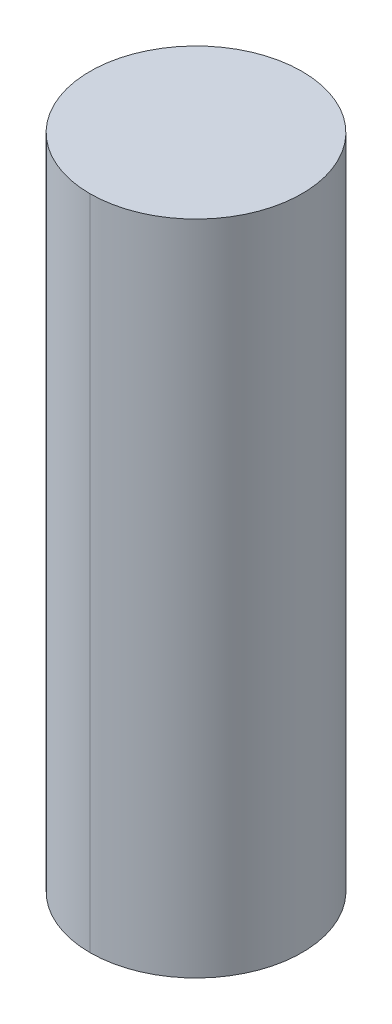
ISO-10303-21;
HEADER;
FILE_DESCRIPTION(('STEP AP214'),'2;1');
FILE_NAME('part.step','',(''),(''),'','','');
FILE_SCHEMA(('AUTOMOTIVE_DESIGN { 1 0 10303 214 1 1 1 1 }'));
ENDSEC;
DATA;
#1=APPLICATION_CONTEXT('core data for automotive mechanical design processes');
#2=APPLICATION_PROTOCOL_DEFINITION('international standard','automotive_design',2000,#1);
#3=PRODUCT_CONTEXT('',#1,'mechanical');
#4=PRODUCT('Part','Part','',(#3));
#5=PRODUCT_RELATED_PRODUCT_CATEGORY('part','',(#4));
#6=PRODUCT_DEFINITION_FORMATION('','',#4);
#7=PRODUCT_DEFINITION_CONTEXT('part definition',#1,'design');
#8=PRODUCT_DEFINITION('design','',#6,#7);
#9=PRODUCT_DEFINITION_SHAPE('','',#8);
#10=(LENGTH_UNIT() NAMED_UNIT(*) SI_UNIT(.MILLI.,.METRE.));
#11=(NAMED_UNIT(*) PLANE_ANGLE_UNIT() SI_UNIT($,.RADIAN.));
#12=(NAMED_UNIT(*) SI_UNIT($,.STERADIAN.) SOLID_ANGLE_UNIT());
#13=UNCERTAINTY_MEASURE_WITH_UNIT(LENGTH_MEASURE(1.E-05),#10,'distance_accuracy_value','');
#14=(GEOMETRIC_REPRESENTATION_CONTEXT(3) GLOBAL_UNCERTAINTY_ASSIGNED_CONTEXT((#13)) GLOBAL_UNIT_ASSIGNED_CONTEXT((#10,
#11,#12)) REPRESENTATION_CONTEXT('',''));
#15=CARTESIAN_POINT('',(0.,0.,0.));
#16=DIRECTION('',(0.,0.,1.));
#17=DIRECTION('',(1.,0.,0.));
#18=AXIS2_PLACEMENT_3D('',#15,#16,#17);
#19=CARTESIAN_POINT('',(0.,98.5,0.));
#20=DIRECTION('',(0.,-1.,0.));
#21=DIRECTION('',(0.,0.,-1.));
#22=AXIS2_PLACEMENT_3D('',#19,#20,#21);
#23=PLANE('',#22);
#24=CARTESIAN_POINT('',(0.,98.5,0.));
#25=DIRECTION('',(0.,-1.,0.));
#26=DIRECTION('',(0.,0.,-1.));
#27=AXIS2_PLACEMENT_3D('',#24,#25,#26);
#28=CIRCLE('',#27,2.5);
#29=CARTESIAN_POINT('',(0.,98.5,2.5));
#30=VERTEX_POINT('',#29);
#31=CARTESIAN_POINT('',(0.,98.5,-2.5));
#32=VERTEX_POINT('',#31);
#33=EDGE_CURVE('E11',#30,#32,#28,.T.);
#34=ORIENTED_EDGE('',*,*,#33,.F.);
#35=CARTESIAN_POINT('',(0.,98.5,0.));
#36=DIRECTION('',(0.,-1.,0.));
#37=DIRECTION('',(0.,0.,-1.));
#38=AXIS2_PLACEMENT_3D('',#35,#36,#37);
#39=CIRCLE('',#38,2.5);
#40=EDGE_CURVE('E25',#32,#30,#39,.T.);
#41=ORIENTED_EDGE('',*,*,#40,.F.);
#42=EDGE_LOOP('',(#34,#41));
#43=FACE_BOUND('',#42,.T.);
#44=ADVANCED_FACE('F17',(#43),#23,.F.);
#45=CARTESIAN_POINT('',(0.,83.,0.));
#46=DIRECTION('',(0.,-1.,0.));
#47=DIRECTION('',(-1.,0.,0.));
#48=AXIS2_PLACEMENT_3D('',#45,#46,#47);
#49=CYLINDRICAL_SURFACE('',#48,2.5);
#50=DIRECTION('',(0.,-1.,0.));
#51=VECTOR('',#50,1.);
#52=CARTESIAN_POINT('',(0.,98.5,2.5));
#53=LINE('',#52,#51);
#54=CARTESIAN_POINT('',(0.,83.,2.5));
#55=VERTEX_POINT('',#54);
#56=EDGE_CURVE('E45',#30,#55,#53,.T.);
#57=ORIENTED_EDGE('',*,*,#56,.T.);
#58=CARTESIAN_POINT('',(0.,83.,0.));
#59=DIRECTION('',(0.,-1.,0.));
#60=DIRECTION('',(0.,0.,-1.));
#61=AXIS2_PLACEMENT_3D('',#58,#59,#60);
#62=CIRCLE('',#61,2.5);
#63=CARTESIAN_POINT('',(0.,83.,-2.5));
#64=VERTEX_POINT('',#63);
#65=EDGE_CURVE('E41',#64,#55,#62,.T.);
#66=ORIENTED_EDGE('',*,*,#65,.F.);
#67=DIRECTION('',(0.,-1.,0.));
#68=VECTOR('',#67,1.);
#69=CARTESIAN_POINT('',(0.,98.5,-2.5));
#70=LINE('',#69,#68);
#71=EDGE_CURVE('E44',#32,#64,#70,.T.);
#72=ORIENTED_EDGE('',*,*,#71,.F.);
#73=ORIENTED_EDGE('',*,*,#40,.T.);
#74=EDGE_LOOP('',(#57,#66,#72,#73));
#75=FACE_BOUND('',#74,.T.);
#76=ADVANCED_FACE('F43',(#75),#49,.T.);
#77=CARTESIAN_POINT('',(0.,83.,0.));
#78=DIRECTION('',(0.,-1.,0.));
#79=DIRECTION('',(1.,0.,0.));
#80=AXIS2_PLACEMENT_3D('',#77,#78,#79);
#81=CYLINDRICAL_SURFACE('',#80,2.5);
#82=ORIENTED_EDGE('',*,*,#56,.F.);
#83=ORIENTED_EDGE('',*,*,#33,.T.);
#84=ORIENTED_EDGE('',*,*,#71,.T.);
#85=CARTESIAN_POINT('',(0.,83.,0.));
#86=DIRECTION('',(0.,-1.,0.));
#87=DIRECTION('',(0.,0.,-1.));
#88=AXIS2_PLACEMENT_3D('',#85,#86,#87);
#89=CIRCLE('',#88,2.5);
#90=EDGE_CURVE('E52',#55,#64,#89,.T.);
#91=ORIENTED_EDGE('',*,*,#90,.F.);
#92=EDGE_LOOP('',(#82,#83,#84,#91));
#93=FACE_BOUND('',#92,.T.);
#94=ADVANCED_FACE('F51',(#93),#81,.T.);
#95=CARTESIAN_POINT('',(0.,83.,-2.5));
#96=DIRECTION('',(0.,1.,0.));
#97=DIRECTION('',(0.,0.,1.));
#98=AXIS2_PLACEMENT_3D('',#95,#96,#97);
#99=PLANE('',#98);
#100=ORIENTED_EDGE('',*,*,#65,.T.);
#101=ORIENTED_EDGE('',*,*,#90,.T.);
#102=EDGE_LOOP('',(#100,#101));
#103=FACE_BOUND('',#102,.T.);
#104=ADVANCED_FACE('F54',(#103),#99,.F.);
#105=CLOSED_SHELL('',(#44,#76,#94,#104));
#106=MANIFOLD_SOLID_BREP('B1',#105);
#107=ADVANCED_BREP_SHAPE_REPRESENTATION('',(#18,#106),#14);
#108=SHAPE_DEFINITION_REPRESENTATION(#9,#107);
ENDSEC;
END-ISO-10303-21;
